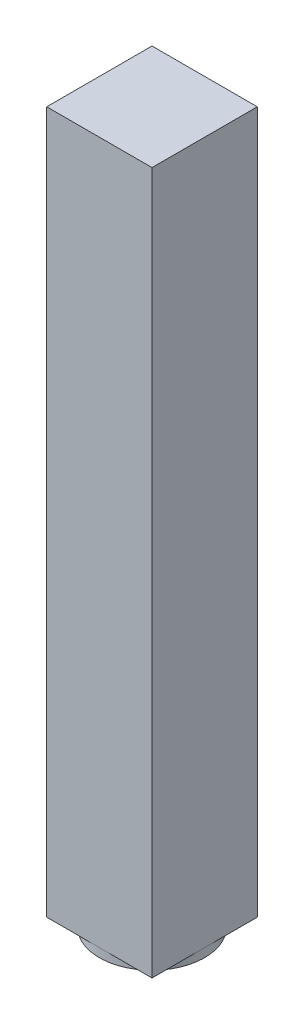
ISO-10303-21;
HEADER;
FILE_DESCRIPTION(('STEP AP214'),'2;1');
FILE_NAME('part.step','',(''),(''),'','','');
FILE_SCHEMA(('AUTOMOTIVE_DESIGN { 1 0 10303 214 1 1 1 1 }'));
ENDSEC;
DATA;
#1=APPLICATION_CONTEXT('core data for automotive mechanical design processes');
#2=APPLICATION_PROTOCOL_DEFINITION('international standard','automotive_design',2000,#1);
#3=PRODUCT_CONTEXT('',#1,'mechanical');
#4=PRODUCT('Part','Part','',(#3));
#5=PRODUCT_RELATED_PRODUCT_CATEGORY('part','',(#4));
#6=PRODUCT_DEFINITION_FORMATION('','',#4);
#7=PRODUCT_DEFINITION_CONTEXT('part definition',#1,'design');
#8=PRODUCT_DEFINITION('design','',#6,#7);
#9=PRODUCT_DEFINITION_SHAPE('','',#8);
#10=(LENGTH_UNIT() NAMED_UNIT(*) SI_UNIT(.MILLI.,.METRE.));
#11=(NAMED_UNIT(*) PLANE_ANGLE_UNIT() SI_UNIT($,.RADIAN.));
#12=(NAMED_UNIT(*) SI_UNIT($,.STERADIAN.) SOLID_ANGLE_UNIT());
#13=UNCERTAINTY_MEASURE_WITH_UNIT(LENGTH_MEASURE(1.E-05),#10,'distance_accuracy_value','');
#14=(GEOMETRIC_REPRESENTATION_CONTEXT(3) GLOBAL_UNCERTAINTY_ASSIGNED_CONTEXT((#13)) GLOBAL_UNIT_ASSIGNED_CONTEXT((#10,
#11,#12)) REPRESENTATION_CONTEXT('',''));
#15=CARTESIAN_POINT('',(0.,0.,0.));
#16=DIRECTION('',(0.,0.,1.));
#17=DIRECTION('',(1.,0.,0.));
#18=AXIS2_PLACEMENT_3D('',#15,#16,#17);
#19=CARTESIAN_POINT('',(0.,0.,0.));
#20=DIRECTION('',(0.,-1.,0.));
#21=DIRECTION('',(0.,0.,-1.));
#22=AXIS2_PLACEMENT_3D('',#19,#20,#21);
#23=PLANE('',#22);
#24=CARTESIAN_POINT('',(0.,0.,0.));
#25=DIRECTION('',(0.,-1.,0.));
#26=DIRECTION('',(0.,0.,-1.));
#27=AXIS2_PLACEMENT_3D('',#24,#25,#26);
#28=CIRCLE('',#27,30.);
#29=CARTESIAN_POINT('',(0.,0.,-30.));
#30=VERTEX_POINT('',#29);
#31=CARTESIAN_POINT('',(30.,0.,0.));
#32=VERTEX_POINT('',#31);
#33=EDGE_CURVE('E55',#30,#32,#28,.T.);
#34=ORIENTED_EDGE('',*,*,#33,.F.);
#35=DIRECTION('',(-1.,0.,0.));
#36=VECTOR('',#35,1.);
#37=CARTESIAN_POINT('',(-30.,0.,-30.));
#38=LINE('',#37,#36);
#39=CARTESIAN_POINT('',(30.,0.,-30.));
#40=VERTEX_POINT('',#39);
#41=EDGE_CURVE('E102',#40,#30,#38,.T.);
#42=ORIENTED_EDGE('',*,*,#41,.F.);
#43=DIRECTION('',(0.,0.,-1.));
#44=VECTOR('',#43,1.);
#45=CARTESIAN_POINT('',(30.,0.,30.));
#46=LINE('',#45,#44);
#47=EDGE_CURVE('E120',#32,#40,#46,.T.);
#48=ORIENTED_EDGE('',*,*,#47,.F.);
#49=EDGE_LOOP('',(#34,#42,#48));
#50=FACE_BOUND('',#49,.T.);
#51=ADVANCED_FACE('F43',(#50),#23,.T.);
#52=CARTESIAN_POINT('',(0.,0.,30.));
#53=VERTEX_POINT('',#52);
#54=EDGE_CURVE('E11',#32,#53,#28,.T.);
#55=ORIENTED_EDGE('',*,*,#54,.F.);
#56=CARTESIAN_POINT('',(30.,0.,30.));
#57=VERTEX_POINT('',#56);
#58=EDGE_CURVE('E118',#57,#32,#46,.T.);
#59=ORIENTED_EDGE('',*,*,#58,.F.);
#60=DIRECTION('',(1.,0.,0.));
#61=VECTOR('',#60,1.);
#62=CARTESIAN_POINT('',(-30.,0.,30.));
#63=LINE('',#62,#61);
#64=EDGE_CURVE('E151',#53,#57,#63,.T.);
#65=ORIENTED_EDGE('',*,*,#64,.F.);
#66=EDGE_LOOP('',(#55,#59,#65));
#67=FACE_BOUND('',#66,.T.);
#68=ADVANCED_FACE('F191',(#67),#23,.T.);
#69=CARTESIAN_POINT('',(-30.,0.,0.));
#70=VERTEX_POINT('',#69);
#71=EDGE_CURVE('E53',#53,#70,#28,.T.);
#72=ORIENTED_EDGE('',*,*,#71,.F.);
#73=CARTESIAN_POINT('',(-30.,0.,30.));
#74=VERTEX_POINT('',#73);
#75=EDGE_CURVE('E137',#74,#53,#63,.T.);
#76=ORIENTED_EDGE('',*,*,#75,.F.);
#77=DIRECTION('',(0.,0.,1.));
#78=VECTOR('',#77,1.);
#79=CARTESIAN_POINT('',(-30.,0.,30.));
#80=LINE('',#79,#78);
#81=EDGE_CURVE('E112',#70,#74,#80,.T.);
#82=ORIENTED_EDGE('',*,*,#81,.F.);
#83=EDGE_LOOP('',(#72,#76,#82));
#84=FACE_BOUND('',#83,.T.);
#85=ADVANCED_FACE('F188',(#84),#23,.T.);
#86=CARTESIAN_POINT('',(30.,400.,30.));
#87=DIRECTION('',(-1.,0.,0.));
#88=DIRECTION('',(0.,0.,1.));
#89=AXIS2_PLACEMENT_3D('',#86,#87,#88);
#90=PLANE('',#89);
#91=ORIENTED_EDGE('',*,*,#58,.T.);
#92=ORIENTED_EDGE('',*,*,#47,.T.);
#93=DIRECTION('',(0.,-1.,0.));
#94=VECTOR('',#93,1.);
#95=CARTESIAN_POINT('',(30.,400.,-30.));
#96=LINE('',#95,#94);
#97=CARTESIAN_POINT('',(30.,400.,-30.));
#98=VERTEX_POINT('',#97);
#99=EDGE_CURVE('E47',#98,#40,#96,.T.);
#100=ORIENTED_EDGE('',*,*,#99,.F.);
#101=DIRECTION('',(0.,0.,-1.));
#102=VECTOR('',#101,1.);
#103=CARTESIAN_POINT('',(30.,400.,30.));
#104=LINE('',#103,#102);
#105=CARTESIAN_POINT('',(30.,400.,30.));
#106=VERTEX_POINT('',#105);
#107=EDGE_CURVE('E132',#106,#98,#104,.T.);
#108=ORIENTED_EDGE('',*,*,#107,.F.);
#109=DIRECTION('',(0.,-1.,0.));
#110=VECTOR('',#109,1.);
#111=CARTESIAN_POINT('',(30.,400.,30.));
#112=LINE('',#111,#110);
#113=EDGE_CURVE('E146',#106,#57,#112,.T.);
#114=ORIENTED_EDGE('',*,*,#113,.T.);
#115=EDGE_LOOP('',(#91,#92,#100,#108,#114));
#116=FACE_BOUND('',#115,.T.);
#117=ADVANCED_FACE('F45',(#116),#90,.F.);
#118=CARTESIAN_POINT('',(-30.,400.,-30.));
#119=DIRECTION('',(0.,0.,1.));
#120=DIRECTION('',(1.,0.,0.));
#121=AXIS2_PLACEMENT_3D('',#118,#119,#120);
#122=PLANE('',#121);
#123=ORIENTED_EDGE('',*,*,#41,.T.);
#124=CARTESIAN_POINT('',(-30.,0.,-30.));
#125=VERTEX_POINT('',#124);
#126=EDGE_CURVE('E105',#30,#125,#38,.T.);
#127=ORIENTED_EDGE('',*,*,#126,.T.);
#128=DIRECTION('',(0.,-1.,0.));
#129=VECTOR('',#128,1.);
#130=CARTESIAN_POINT('',(-30.,400.,-30.));
#131=LINE('',#130,#129);
#132=CARTESIAN_POINT('',(-30.,400.,-30.));
#133=VERTEX_POINT('',#132);
#134=EDGE_CURVE('E129',#133,#125,#131,.T.);
#135=ORIENTED_EDGE('',*,*,#134,.F.);
#136=DIRECTION('',(-1.,0.,0.));
#137=VECTOR('',#136,1.);
#138=CARTESIAN_POINT('',(-30.,400.,-30.));
#139=LINE('',#138,#137);
#140=EDGE_CURVE('E136',#98,#133,#139,.T.);
#141=ORIENTED_EDGE('',*,*,#140,.F.);
#142=ORIENTED_EDGE('',*,*,#99,.T.);
#143=EDGE_LOOP('',(#123,#127,#135,#141,#142));
#144=FACE_BOUND('',#143,.T.);
#145=ADVANCED_FACE('F103',(#144),#122,.F.);
#146=CARTESIAN_POINT('',(-30.,400.,30.));
#147=DIRECTION('',(1.,0.,0.));
#148=DIRECTION('',(0.,0.,-1.));
#149=AXIS2_PLACEMENT_3D('',#146,#147,#148);
#150=PLANE('',#149);
#151=EDGE_CURVE('E116',#125,#70,#80,.T.);
#152=ORIENTED_EDGE('',*,*,#151,.T.);
#153=ORIENTED_EDGE('',*,*,#81,.T.);
#154=DIRECTION('',(0.,-1.,0.));
#155=VECTOR('',#154,1.);
#156=CARTESIAN_POINT('',(-30.,400.,30.));
#157=LINE('',#156,#155);
#158=CARTESIAN_POINT('',(-30.,400.,30.));
#159=VERTEX_POINT('',#158);
#160=EDGE_CURVE('E158',#159,#74,#157,.T.);
#161=ORIENTED_EDGE('',*,*,#160,.F.);
#162=DIRECTION('',(0.,0.,1.));
#163=VECTOR('',#162,1.);
#164=CARTESIAN_POINT('',(-30.,400.,30.));
#165=LINE('',#164,#163);
#166=EDGE_CURVE('E140',#133,#159,#165,.T.);
#167=ORIENTED_EDGE('',*,*,#166,.F.);
#168=ORIENTED_EDGE('',*,*,#134,.T.);
#169=EDGE_LOOP('',(#152,#153,#161,#167,#168));
#170=FACE_BOUND('',#169,.T.);
#171=ADVANCED_FACE('F164',(#170),#150,.F.);
#172=CARTESIAN_POINT('',(-30.,400.,30.));
#173=DIRECTION('',(0.,0.,-1.));
#174=DIRECTION('',(-1.,0.,0.));
#175=AXIS2_PLACEMENT_3D('',#172,#173,#174);
#176=PLANE('',#175);
#177=ORIENTED_EDGE('',*,*,#75,.T.);
#178=ORIENTED_EDGE('',*,*,#64,.T.);
#179=ORIENTED_EDGE('',*,*,#113,.F.);
#180=DIRECTION('',(1.,0.,0.));
#181=VECTOR('',#180,1.);
#182=CARTESIAN_POINT('',(-30.,400.,30.));
#183=LINE('',#182,#181);
#184=EDGE_CURVE('E143',#159,#106,#183,.T.);
#185=ORIENTED_EDGE('',*,*,#184,.F.);
#186=ORIENTED_EDGE('',*,*,#160,.T.);
#187=EDGE_LOOP('',(#177,#178,#179,#185,#186));
#188=FACE_BOUND('',#187,.T.);
#189=ADVANCED_FACE('F197',(#188),#176,.F.);
#190=CARTESIAN_POINT('',(0.,400.,0.));
#191=DIRECTION('',(0.,-1.,0.));
#192=DIRECTION('',(0.,0.,-1.));
#193=AXIS2_PLACEMENT_3D('',#190,#191,#192);
#194=PLANE('',#193);
#195=ORIENTED_EDGE('',*,*,#107,.T.);
#196=ORIENTED_EDGE('',*,*,#140,.T.);
#197=ORIENTED_EDGE('',*,*,#166,.T.);
#198=ORIENTED_EDGE('',*,*,#184,.T.);
#199=EDGE_LOOP('',(#195,#196,#197,#198));
#200=FACE_BOUND('',#199,.T.);
#201=ADVANCED_FACE('F168',(#200),#194,.F.);
#202=EDGE_CURVE('E62',#70,#30,#28,.T.);
#203=ORIENTED_EDGE('',*,*,#202,.F.);
#204=ORIENTED_EDGE('',*,*,#151,.F.);
#205=ORIENTED_EDGE('',*,*,#126,.F.);
#206=EDGE_LOOP('',(#203,#204,#205));
#207=FACE_BOUND('',#206,.T.);
#208=ADVANCED_FACE('F114',(#207),#23,.T.);
#209=CARTESIAN_POINT('',(0.,-5.,0.));
#210=DIRECTION('',(0.,1.,0.));
#211=DIRECTION('',(0.,0.,1.));
#212=AXIS2_PLACEMENT_3D('',#209,#210,#211);
#213=CYLINDRICAL_SURFACE('',#212,30.);
#214=CARTESIAN_POINT('',(0.,-5.,0.));
#215=DIRECTION('',(0.,-1.,0.));
#216=DIRECTION('',(0.,0.,-1.));
#217=AXIS2_PLACEMENT_3D('',#214,#215,#216);
#218=CIRCLE('',#217,30.);
#219=CARTESIAN_POINT('',(0.,-5.,-30.));
#220=VERTEX_POINT('',#219);
#221=EDGE_CURVE('E124',#220,#220,#218,.T.);
#222=ORIENTED_EDGE('',*,*,#221,.F.);
#223=EDGE_LOOP('',(#222));
#224=FACE_BOUND('',#223,.T.);
#225=ORIENTED_EDGE('',*,*,#33,.T.);
#226=ORIENTED_EDGE('',*,*,#54,.T.);
#227=ORIENTED_EDGE('',*,*,#71,.T.);
#228=ORIENTED_EDGE('',*,*,#202,.T.);
#229=EDGE_LOOP('',(#225,#226,#227,#228));
#230=FACE_BOUND('',#229,.T.);
#231=ADVANCED_FACE('F125',(#224,#230),#213,.T.);
#232=CARTESIAN_POINT('',(0.,-5.,0.));
#233=DIRECTION('',(0.,-1.,0.));
#234=DIRECTION('',(0.,0.,-1.));
#235=AXIS2_PLACEMENT_3D('',#232,#233,#234);
#236=PLANE('',#235);
#237=ORIENTED_EDGE('',*,*,#221,.T.);
#238=EDGE_LOOP('',(#237));
#239=FACE_BOUND('',#238,.T.);
#240=ADVANCED_FACE('F178',(#239),#236,.T.);
#241=CLOSED_SHELL('',(#51,#68,#85,#117,#145,#171,#189,#201,#208,#231,#240));
#242=MANIFOLD_SOLID_BREP('B2',#241);
#243=ADVANCED_BREP_SHAPE_REPRESENTATION('',(#18,#242),#14);
#244=SHAPE_DEFINITION_REPRESENTATION(#9,#243);
ENDSEC;
END-ISO-10303-21;
